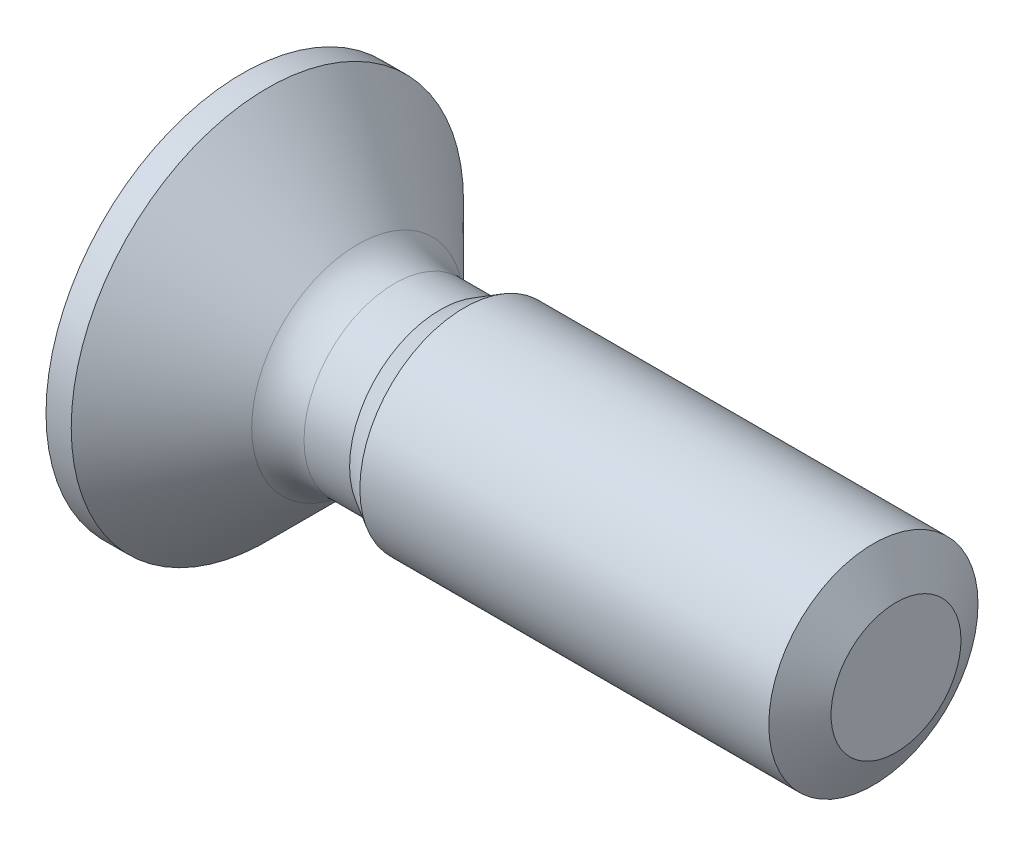
ISO-10303-21;
HEADER;
FILE_DESCRIPTION(('STEP AP214'),'2;1');
FILE_NAME('part.step','',(''),(''),'','','');
FILE_SCHEMA(('AUTOMOTIVE_DESIGN { 1 0 10303 214 1 1 1 1 }'));
ENDSEC;
DATA;
#1=APPLICATION_CONTEXT('core data for automotive mechanical design processes');
#2=APPLICATION_PROTOCOL_DEFINITION('international standard','automotive_design',2000,#1);
#3=PRODUCT_CONTEXT('',#1,'mechanical');
#4=PRODUCT('Part','Part','',(#3));
#5=PRODUCT_RELATED_PRODUCT_CATEGORY('part','',(#4));
#6=PRODUCT_DEFINITION_FORMATION('','',#4);
#7=PRODUCT_DEFINITION_CONTEXT('part definition',#1,'design');
#8=PRODUCT_DEFINITION('design','',#6,#7);
#9=PRODUCT_DEFINITION_SHAPE('','',#8);
#10=(LENGTH_UNIT() NAMED_UNIT(*) SI_UNIT(.MILLI.,.METRE.));
#11=(NAMED_UNIT(*) PLANE_ANGLE_UNIT() SI_UNIT($,.RADIAN.));
#12=(NAMED_UNIT(*) SI_UNIT($,.STERADIAN.) SOLID_ANGLE_UNIT());
#13=UNCERTAINTY_MEASURE_WITH_UNIT(LENGTH_MEASURE(1.E-05),#10,'distance_accuracy_value','');
#14=(GEOMETRIC_REPRESENTATION_CONTEXT(3) GLOBAL_UNCERTAINTY_ASSIGNED_CONTEXT((#13)) GLOBAL_UNIT_ASSIGNED_CONTEXT((#10,
#11,#12)) REPRESENTATION_CONTEXT('',''));
#15=CARTESIAN_POINT('',(0.,0.,0.));
#16=DIRECTION('',(0.,0.,1.));
#17=DIRECTION('',(1.,0.,0.));
#18=AXIS2_PLACEMENT_3D('',#15,#16,#17);
#19=CARTESIAN_POINT('',(0.,0.,0.));
#20=DIRECTION('',(1.,0.,0.));
#21=DIRECTION('',(0.,0.,-1.));
#22=AXIS2_PLACEMENT_3D('',#19,#20,#21);
#23=PLANE('',#22);
#24=CARTESIAN_POINT('',(0.,0.,0.));
#25=DIRECTION('',(-1.,0.,0.));
#26=DIRECTION('',(0.,0.,1.));
#27=AXIS2_PLACEMENT_3D('',#24,#25,#26);
#28=CIRCLE('',#27,1.5);
#29=CARTESIAN_POINT('',(0.,0.,1.5));
#30=VERTEX_POINT('',#29);
#31=EDGE_CURVE('E178',#30,#30,#28,.T.);
#32=ORIENTED_EDGE('',*,*,#31,.T.);
#33=EDGE_LOOP('',(#32));
#34=FACE_BOUND('',#33,.T.);
#35=DIRECTION('',(0.,1.,0.));
#36=VECTOR('',#35,1.);
#37=CARTESIAN_POINT('',(0.,0.799999999999999,0.175000000000003));
#38=LINE('',#37,#36);
#39=CARTESIAN_POINT('',(0.,0.175,0.175000000000001));
#40=VERTEX_POINT('',#39);
#41=CARTESIAN_POINT('',(0.,0.799999999999999,0.175000000000003));
#42=VERTEX_POINT('',#41);
#43=EDGE_CURVE('E100',#40,#42,#38,.T.);
#44=ORIENTED_EDGE('',*,*,#43,.F.);
#45=DIRECTION('',(0.,0.,-1.));
#46=VECTOR('',#45,1.);
#47=CARTESIAN_POINT('',(0.,0.175,-0.8));
#48=LINE('',#47,#46);
#49=CARTESIAN_POINT('',(0.,0.175,0.8));
#50=VERTEX_POINT('',#49);
#51=EDGE_CURVE('E145',#50,#40,#48,.T.);
#52=ORIENTED_EDGE('',*,*,#51,.F.);
#53=DIRECTION('',(0.,1.,0.));
#54=VECTOR('',#53,1.);
#55=CARTESIAN_POINT('',(0.,0.175,0.8));
#56=LINE('',#55,#54);
#57=CARTESIAN_POINT('',(0.,-0.175,0.8));
#58=VERTEX_POINT('',#57);
#59=EDGE_CURVE('E142',#58,#50,#56,.T.);
#60=ORIENTED_EDGE('',*,*,#59,.F.);
#61=DIRECTION('',(0.,0.,1.));
#62=VECTOR('',#61,1.);
#63=CARTESIAN_POINT('',(0.,-0.175,-0.8));
#64=LINE('',#63,#62);
#65=CARTESIAN_POINT('',(0.,-0.175,0.174999999999999));
#66=VERTEX_POINT('',#65);
#67=EDGE_CURVE('E73',#66,#58,#64,.T.);
#68=ORIENTED_EDGE('',*,*,#67,.F.);
#69=CARTESIAN_POINT('',(0.,-0.800000000000001,0.174999999999997));
#70=VERTEX_POINT('',#69);
#71=EDGE_CURVE('E108',#70,#66,#38,.T.);
#72=ORIENTED_EDGE('',*,*,#71,.F.);
#73=DIRECTION('',(0.,0.,1.));
#74=VECTOR('',#73,1.);
#75=CARTESIAN_POINT('',(0.,-0.800000000000001,0.174999999999997));
#76=LINE('',#75,#74);
#77=CARTESIAN_POINT('',(0.,-0.799999999999999,-0.175000000000003));
#78=VERTEX_POINT('',#77);
#79=EDGE_CURVE('E109',#78,#70,#76,.T.);
#80=ORIENTED_EDGE('',*,*,#79,.F.);
#81=DIRECTION('',(0.,-1.,0.));
#82=VECTOR('',#81,1.);
#83=CARTESIAN_POINT('',(0.,0.800000000000001,-0.174999999999997));
#84=LINE('',#83,#82);
#85=CARTESIAN_POINT('',(0.,-0.175,-0.175000000000001));
#86=VERTEX_POINT('',#85);
#87=EDGE_CURVE('E122',#86,#78,#84,.T.);
#88=ORIENTED_EDGE('',*,*,#87,.F.);
#89=CARTESIAN_POINT('',(0.,-0.175,-0.8));
#90=VERTEX_POINT('',#89);
#91=EDGE_CURVE('E139',#90,#86,#64,.T.);
#92=ORIENTED_EDGE('',*,*,#91,.F.);
#93=DIRECTION('',(0.,-1.,0.));
#94=VECTOR('',#93,1.);
#95=CARTESIAN_POINT('',(0.,0.175,-0.8));
#96=LINE('',#95,#94);
#97=CARTESIAN_POINT('',(0.,0.175,-0.8));
#98=VERTEX_POINT('',#97);
#99=EDGE_CURVE('E50',#98,#90,#96,.T.);
#100=ORIENTED_EDGE('',*,*,#99,.F.);
#101=CARTESIAN_POINT('',(0.,0.175,-0.174999999999999));
#102=VERTEX_POINT('',#101);
#103=EDGE_CURVE('E148',#102,#98,#48,.T.);
#104=ORIENTED_EDGE('',*,*,#103,.F.);
#105=CARTESIAN_POINT('',(0.,0.800000000000001,-0.174999999999997));
#106=VERTEX_POINT('',#105);
#107=EDGE_CURVE('E121',#106,#102,#84,.T.);
#108=ORIENTED_EDGE('',*,*,#107,.F.);
#109=DIRECTION('',(0.,0.,-1.));
#110=VECTOR('',#109,1.);
#111=CARTESIAN_POINT('',(0.,0.799999999999999,0.175000000000003));
#112=LINE('',#111,#110);
#113=EDGE_CURVE('E114',#42,#106,#112,.T.);
#114=ORIENTED_EDGE('',*,*,#113,.F.);
#115=EDGE_LOOP('',(#44,#52,#60,#68,#72,#80,#88,#92,#100,#104,#108,#114));
#116=FACE_BOUND('',#115,.T.);
#117=ADVANCED_FACE('F36',(#34,#116),#23,.F.);
#118=CARTESIAN_POINT('',(0.9,0.,0.));
#119=DIRECTION('',(-0.190869659102224,-0.981615389668581,0.));
#120=DIRECTION('',(0.981615389668581,-0.190869659102224,0.));
#121=AXIS2_PLACEMENT_3D('',#118,#119,#120);
#122=PLANE('',#121);
#123=ORIENTED_EDGE('',*,*,#51,.T.);
#124=DIRECTION('',(0.964208851210044,-0.187485054401953,-0.187485054401954));
#125=VECTOR('',#124,1.);
#126=CARTESIAN_POINT('',(0.9,0.,0.));
#127=LINE('',#126,#125);
#128=CARTESIAN_POINT('',(0.9,0.,0.));
#129=VERTEX_POINT('',#128);
#130=EDGE_CURVE('E79',#40,#129,#127,.T.);
#131=ORIENTED_EDGE('',*,*,#130,.T.);
#132=DIRECTION('',(0.739639285522949,-0.143818749962796,-0.657457142687066));
#133=VECTOR('',#132,1.);
#134=CARTESIAN_POINT('',(0.,0.175,0.8));
#135=LINE('',#134,#133);
#136=EDGE_CURVE('E59',#50,#129,#135,.T.);
#137=ORIENTED_EDGE('',*,*,#136,.F.);
#138=EDGE_LOOP('',(#123,#131,#137));
#139=FACE_BOUND('',#138,.T.);
#140=ADVANCED_FACE('F194',(#139),#122,.T.);
#141=DIRECTION('',(0.739639285522949,-0.143818749962796,0.657457142687066));
#142=VECTOR('',#141,1.);
#143=CARTESIAN_POINT('',(0.,0.175,-0.8));
#144=LINE('',#143,#142);
#145=EDGE_CURVE('E144',#98,#129,#144,.T.);
#146=ORIENTED_EDGE('',*,*,#145,.T.);
#147=DIRECTION('',(-0.964208851210045,0.187485054401953,-0.187485054401952));
#148=VECTOR('',#147,1.);
#149=CARTESIAN_POINT('',(0.9,0.,0.));
#150=LINE('',#149,#148);
#151=EDGE_CURVE('E126',#129,#102,#150,.T.);
#152=ORIENTED_EDGE('',*,*,#151,.T.);
#153=ORIENTED_EDGE('',*,*,#103,.T.);
#154=EDGE_LOOP('',(#146,#152,#153));
#155=FACE_BOUND('',#154,.T.);
#156=ADVANCED_FACE('F188',(#155),#122,.T.);
#157=CARTESIAN_POINT('',(0.9,0.,0.));
#158=DIRECTION('',(-0.190869659102224,0.981615389668581,0.));
#159=DIRECTION('',(-0.981615389668581,-0.190869659102224,0.));
#160=AXIS2_PLACEMENT_3D('',#157,#158,#159);
#161=PLANE('',#160);
#162=DIRECTION('',(0.739639285522949,0.143818749962796,-0.657457142687066));
#163=VECTOR('',#162,1.);
#164=CARTESIAN_POINT('',(0.,-0.175,0.8));
#165=LINE('',#164,#163);
#166=EDGE_CURVE('E138',#58,#129,#165,.T.);
#167=ORIENTED_EDGE('',*,*,#166,.T.);
#168=DIRECTION('',(-0.964208851210045,-0.187485054401953,0.187485054401952));
#169=VECTOR('',#168,1.);
#170=CARTESIAN_POINT('',(0.9,0.,0.));
#171=LINE('',#170,#169);
#172=EDGE_CURVE('E11',#129,#66,#171,.T.);
#173=ORIENTED_EDGE('',*,*,#172,.T.);
#174=ORIENTED_EDGE('',*,*,#67,.T.);
#175=EDGE_LOOP('',(#167,#173,#174));
#176=FACE_BOUND('',#175,.T.);
#177=ADVANCED_FACE('F189',(#176),#161,.T.);
#178=ORIENTED_EDGE('',*,*,#91,.T.);
#179=DIRECTION('',(0.964208851210044,0.187485054401953,0.187485054401954));
#180=VECTOR('',#179,1.);
#181=CARTESIAN_POINT('',(0.9,0.,0.));
#182=LINE('',#181,#180);
#183=EDGE_CURVE('E43',#86,#129,#182,.T.);
#184=ORIENTED_EDGE('',*,*,#183,.T.);
#185=DIRECTION('',(0.739639285522949,0.143818749962796,0.657457142687066));
#186=VECTOR('',#185,1.);
#187=CARTESIAN_POINT('',(0.,-0.175,-0.8));
#188=LINE('',#187,#186);
#189=EDGE_CURVE('E153',#90,#129,#188,.T.);
#190=ORIENTED_EDGE('',*,*,#189,.F.);
#191=EDGE_LOOP('',(#178,#184,#190));
#192=FACE_BOUND('',#191,.T.);
#193=ADVANCED_FACE('F182',(#192),#161,.T.);
#194=CARTESIAN_POINT('',(0.,0.,0.));
#195=DIRECTION('',(-1.,0.,0.));
#196=DIRECTION('',(0.,0.,1.));
#197=AXIS2_PLACEMENT_3D('',#194,#195,#196);
#198=CYLINDRICAL_SURFACE('',#197,1.5);
#199=ORIENTED_EDGE('',*,*,#31,.F.);
#200=EDGE_LOOP('',(#199));
#201=FACE_BOUND('',#200,.T.);
#202=CARTESIAN_POINT('',(0.192800000000003,0.,0.));
#203=DIRECTION('',(-1.,0.,0.));
#204=DIRECTION('',(0.,0.,1.));
#205=AXIS2_PLACEMENT_3D('',#202,#203,#204);
#206=CIRCLE('',#205,1.5);
#207=CARTESIAN_POINT('',(0.192800000000003,0.,1.5));
#208=VERTEX_POINT('',#207);
#209=EDGE_CURVE('E174',#208,#208,#206,.T.);
#210=ORIENTED_EDGE('',*,*,#209,.T.);
#211=EDGE_LOOP('',(#210));
#212=FACE_BOUND('',#211,.T.);
#213=ADVANCED_FACE('F222',(#201,#212),#198,.T.);
#214=CARTESIAN_POINT('',(0.882842712474619,0.,0.));
#215=DIRECTION('',(-1.,0.,0.));
#216=DIRECTION('',(0.,0.,1.));
#217=AXIS2_PLACEMENT_3D('',#214,#215,#216);
#218=CONICAL_SURFACE('',#217,0.809957287525381,0.78539816339745);
#219=ORIENTED_EDGE('',*,*,#209,.F.);
#220=EDGE_LOOP('',(#219));
#221=FACE_BOUND('',#220,.T.);
#222=CARTESIAN_POINT('',(0.882842712474619,0.,0.));
#223=DIRECTION('',(-1.,0.,0.));
#224=DIRECTION('',(0.,0.,1.));
#225=AXIS2_PLACEMENT_3D('',#222,#223,#224);
#226=CIRCLE('',#225,0.809957287525381);
#227=CARTESIAN_POINT('',(0.882842712474619,0.,0.809957287525381));
#228=VERTEX_POINT('',#227);
#229=EDGE_CURVE('E170',#228,#228,#226,.T.);
#230=ORIENTED_EDGE('',*,*,#229,.T.);
#231=EDGE_LOOP('',(#230));
#232=FACE_BOUND('',#231,.T.);
#233=ADVANCED_FACE('F225',(#221,#232),#218,.T.);
#234=CARTESIAN_POINT('',(1.16568542494924,0.,0.));
#235=DIRECTION('',(-1.,0.,0.));
#236=DIRECTION('',(0.,0.,1.));
#237=AXIS2_PLACEMENT_3D('',#234,#235,#236);
#238=TOROIDAL_SURFACE('',#237,1.0928,0.4);
#239=ORIENTED_EDGE('',*,*,#229,.F.);
#240=EDGE_LOOP('',(#239));
#241=FACE_BOUND('',#240,.T.);
#242=CARTESIAN_POINT('',(1.16568542494924,0.,0.));
#243=DIRECTION('',(-1.,0.,0.));
#244=DIRECTION('',(0.,0.,1.));
#245=AXIS2_PLACEMENT_3D('',#242,#243,#244);
#246=CIRCLE('',#245,0.6928);
#247=CARTESIAN_POINT('',(1.16568542494924,0.,0.6928));
#248=VERTEX_POINT('',#247);
#249=EDGE_CURVE('E167',#248,#248,#246,.T.);
#250=ORIENTED_EDGE('',*,*,#249,.T.);
#251=EDGE_LOOP('',(#250));
#252=FACE_BOUND('',#251,.T.);
#253=ADVANCED_FACE('F230',(#241,#252),#238,.F.);
#254=CARTESIAN_POINT('',(0.,0.,0.));
#255=DIRECTION('',(-1.,0.,0.));
#256=DIRECTION('',(0.,0.,1.));
#257=AXIS2_PLACEMENT_3D('',#254,#255,#256);
#258=CYLINDRICAL_SURFACE('',#257,0.6928);
#259=ORIENTED_EDGE('',*,*,#249,.F.);
#260=EDGE_LOOP('',(#259));
#261=FACE_BOUND('',#260,.T.);
#262=CARTESIAN_POINT('',(1.51432415342862,0.,0.));
#263=DIRECTION('',(-1.,0.,0.));
#264=DIRECTION('',(0.,0.,1.));
#265=AXIS2_PLACEMENT_3D('',#262,#263,#264);
#266=CIRCLE('',#265,0.6928);
#267=CARTESIAN_POINT('',(1.51432415342862,0.,0.6928));
#268=VERTEX_POINT('',#267);
#269=EDGE_CURVE('E164',#268,#268,#266,.T.);
#270=ORIENTED_EDGE('',*,*,#269,.T.);
#271=EDGE_LOOP('',(#270));
#272=FACE_BOUND('',#271,.T.);
#273=ADVANCED_FACE('F236',(#261,#272),#258,.T.);
#274=CARTESIAN_POINT('',(1.7,0.,0.));
#275=DIRECTION('',(1.,0.,0.));
#276=DIRECTION('',(0.,0.,-1.));
#277=AXIS2_PLACEMENT_3D('',#274,#275,#276);
#278=CONICAL_SURFACE('',#277,0.8,0.5235987755983);
#279=ORIENTED_EDGE('',*,*,#269,.F.);
#280=EDGE_LOOP('',(#279));
#281=FACE_BOUND('',#280,.T.);
#282=CARTESIAN_POINT('',(1.7,0.,0.));
#283=DIRECTION('',(-1.,0.,0.));
#284=DIRECTION('',(0.,0.,1.));
#285=AXIS2_PLACEMENT_3D('',#282,#283,#284);
#286=CIRCLE('',#285,0.8);
#287=CARTESIAN_POINT('',(1.7,0.,0.8));
#288=VERTEX_POINT('',#287);
#289=EDGE_CURVE('E161',#288,#288,#286,.T.);
#290=ORIENTED_EDGE('',*,*,#289,.T.);
#291=EDGE_LOOP('',(#290));
#292=FACE_BOUND('',#291,.T.);
#293=ADVANCED_FACE('F242',(#281,#292),#278,.T.);
#294=CARTESIAN_POINT('',(0.,0.,0.));
#295=DIRECTION('',(-1.,0.,0.));
#296=DIRECTION('',(0.,0.,1.));
#297=AXIS2_PLACEMENT_3D('',#294,#295,#296);
#298=CYLINDRICAL_SURFACE('',#297,0.8);
#299=CARTESIAN_POINT('',(4.8268956020098,0.,0.));
#300=DIRECTION('',(1.,0.,0.));
#301=DIRECTION('',(0.,0.,-1.));
#302=AXIS2_PLACEMENT_3D('',#299,#300,#301);
#303=CIRCLE('',#302,0.799999999999999);
#304=CARTESIAN_POINT('',(4.8268956020098,0.,-0.799999999999999));
#305=VERTEX_POINT('',#304);
#306=EDGE_CURVE('E158',#305,#305,#303,.T.);
#307=ORIENTED_EDGE('',*,*,#306,.F.);
#308=EDGE_LOOP('',(#307));
#309=FACE_BOUND('',#308,.T.);
#310=ORIENTED_EDGE('',*,*,#289,.F.);
#311=EDGE_LOOP('',(#310));
#312=FACE_BOUND('',#311,.T.);
#313=ADVANCED_FACE('F248',(#309,#312),#298,.T.);
#314=CARTESIAN_POINT('',(4.8268956020098,0.,0.));
#315=DIRECTION('',(-1.,0.,0.));
#316=DIRECTION('',(0.,0.,1.));
#317=AXIS2_PLACEMENT_3D('',#314,#315,#316);
#318=CONICAL_SURFACE('',#317,0.799999999999999,1.05188801855118);
#319=CARTESIAN_POINT('',(5.,0.,0.));
#320=DIRECTION('',(1.,0.,0.));
#321=DIRECTION('',(0.,0.,-1.));
#322=AXIS2_PLACEMENT_3D('',#319,#320,#321);
#323=CIRCLE('',#322,0.496899999999999);
#324=CARTESIAN_POINT('',(5.,0.,-0.496899999999999));
#325=VERTEX_POINT('',#324);
#326=EDGE_CURVE('E147',#325,#325,#323,.T.);
#327=ORIENTED_EDGE('',*,*,#326,.F.);
#328=EDGE_LOOP('',(#327));
#329=FACE_BOUND('',#328,.T.);
#330=ORIENTED_EDGE('',*,*,#306,.T.);
#331=EDGE_LOOP('',(#330));
#332=FACE_BOUND('',#331,.T.);
#333=ADVANCED_FACE('F253',(#329,#332),#318,.T.);
#334=CARTESIAN_POINT('',(5.,0.8,0.));
#335=DIRECTION('',(-1.,0.,0.));
#336=DIRECTION('',(0.,0.,1.));
#337=AXIS2_PLACEMENT_3D('',#334,#335,#336);
#338=PLANE('',#337);
#339=ORIENTED_EDGE('',*,*,#326,.T.);
#340=EDGE_LOOP('',(#339));
#341=FACE_BOUND('',#340,.T.);
#342=ADVANCED_FACE('F259',(#341),#338,.F.);
#343=CARTESIAN_POINT('',(0.,0.175,-0.8));
#344=DIRECTION('',(0.66436383882992,0.,-0.74740931868366));
#345=DIRECTION('',(-0.74740931868366,0.,-0.66436383882992));
#346=AXIS2_PLACEMENT_3D('',#343,#344,#345);
#347=PLANE('',#346);
#348=ORIENTED_EDGE('',*,*,#145,.F.);
#349=ORIENTED_EDGE('',*,*,#99,.T.);
#350=ORIENTED_EDGE('',*,*,#189,.T.);
#351=EDGE_LOOP('',(#348,#349,#350));
#352=FACE_BOUND('',#351,.T.);
#353=ADVANCED_FACE('F186',(#352),#347,.F.);
#354=CARTESIAN_POINT('',(0.,-0.175,0.8));
#355=DIRECTION('',(0.66436383882992,0.,0.74740931868366));
#356=DIRECTION('',(0.74740931868366,0.,-0.66436383882992));
#357=AXIS2_PLACEMENT_3D('',#354,#355,#356);
#358=PLANE('',#357);
#359=ORIENTED_EDGE('',*,*,#166,.F.);
#360=ORIENTED_EDGE('',*,*,#59,.T.);
#361=ORIENTED_EDGE('',*,*,#136,.T.);
#362=EDGE_LOOP('',(#359,#360,#361));
#363=FACE_BOUND('',#362,.T.);
#364=ADVANCED_FACE('F193',(#363),#358,.F.);
#365=CARTESIAN_POINT('',(0.9,0.,0.));
#366=DIRECTION('',(-0.190869659102224,0.,-0.981615389668581));
#367=DIRECTION('',(0.981615389668581,0.,-0.190869659102224));
#368=AXIS2_PLACEMENT_3D('',#365,#366,#367);
#369=PLANE('',#368);
#370=DIRECTION('',(0.739639285522949,0.657457142687066,-0.143818749962793));
#371=VECTOR('',#370,1.);
#372=CARTESIAN_POINT('',(0.,-0.800000000000001,0.174999999999997));
#373=LINE('',#372,#371);
#374=EDGE_CURVE('E118',#70,#129,#373,.T.);
#375=ORIENTED_EDGE('',*,*,#374,.F.);
#376=ORIENTED_EDGE('',*,*,#71,.T.);
#377=ORIENTED_EDGE('',*,*,#172,.F.);
#378=EDGE_LOOP('',(#375,#376,#377));
#379=FACE_BOUND('',#378,.T.);
#380=ADVANCED_FACE('F198',(#379),#369,.T.);
#381=CARTESIAN_POINT('',(0.9,0.,0.));
#382=DIRECTION('',(-0.190869659102224,0.,0.981615389668581));
#383=DIRECTION('',(-0.981615389668581,0.,-0.190869659102224));
#384=AXIS2_PLACEMENT_3D('',#381,#382,#383);
#385=PLANE('',#384);
#386=ORIENTED_EDGE('',*,*,#87,.T.);
#387=DIRECTION('',(0.739639285522949,0.657457142687065,0.143818749962798));
#388=VECTOR('',#387,1.);
#389=CARTESIAN_POINT('',(0.,-0.799999999999999,-0.175000000000003));
#390=LINE('',#389,#388);
#391=EDGE_CURVE('E132',#78,#129,#390,.T.);
#392=ORIENTED_EDGE('',*,*,#391,.T.);
#393=ORIENTED_EDGE('',*,*,#183,.F.);
#394=EDGE_LOOP('',(#386,#392,#393));
#395=FACE_BOUND('',#394,.T.);
#396=ADVANCED_FACE('F202',(#395),#385,.T.);
#397=CARTESIAN_POINT('',(0.,-0.799999999999999,-0.175000000000003));
#398=DIRECTION('',(0.66436383882992,-0.74740931868366,0.));
#399=DIRECTION('',(0.74740931868366,0.66436383882992,0.));
#400=AXIS2_PLACEMENT_3D('',#397,#398,#399);
#401=PLANE('',#400);
#402=ORIENTED_EDGE('',*,*,#391,.F.);
#403=ORIENTED_EDGE('',*,*,#79,.T.);
#404=ORIENTED_EDGE('',*,*,#374,.T.);
#405=EDGE_LOOP('',(#402,#403,#404));
#406=FACE_BOUND('',#405,.T.);
#407=ADVANCED_FACE('F201',(#406),#401,.F.);
#408=ORIENTED_EDGE('',*,*,#43,.T.);
#409=DIRECTION('',(0.739639285522949,-0.657457142687065,-0.143818749962798));
#410=VECTOR('',#409,1.);
#411=CARTESIAN_POINT('',(0.,0.799999999999999,0.175000000000003));
#412=LINE('',#411,#410);
#413=EDGE_CURVE('E103',#42,#129,#412,.T.);
#414=ORIENTED_EDGE('',*,*,#413,.T.);
#415=ORIENTED_EDGE('',*,*,#130,.F.);
#416=EDGE_LOOP('',(#408,#414,#415));
#417=FACE_BOUND('',#416,.T.);
#418=ADVANCED_FACE('F102',(#417),#369,.T.);
#419=DIRECTION('',(0.739639285522949,-0.657457142687066,0.143818749962793));
#420=VECTOR('',#419,1.);
#421=CARTESIAN_POINT('',(0.,0.800000000000001,-0.174999999999997));
#422=LINE('',#421,#420);
#423=EDGE_CURVE('E116',#106,#129,#422,.T.);
#424=ORIENTED_EDGE('',*,*,#423,.F.);
#425=ORIENTED_EDGE('',*,*,#107,.T.);
#426=ORIENTED_EDGE('',*,*,#151,.F.);
#427=EDGE_LOOP('',(#424,#425,#426));
#428=FACE_BOUND('',#427,.T.);
#429=ADVANCED_FACE('F205',(#428),#385,.T.);
#430=CARTESIAN_POINT('',(0.,0.799999999999999,0.175000000000003));
#431=DIRECTION('',(0.66436383882992,0.74740931868366,0.));
#432=DIRECTION('',(-0.74740931868366,0.66436383882992,0.));
#433=AXIS2_PLACEMENT_3D('',#430,#431,#432);
#434=PLANE('',#433);
#435=ORIENTED_EDGE('',*,*,#413,.F.);
#436=ORIENTED_EDGE('',*,*,#113,.T.);
#437=ORIENTED_EDGE('',*,*,#423,.T.);
#438=EDGE_LOOP('',(#435,#436,#437));
#439=FACE_BOUND('',#438,.T.);
#440=ADVANCED_FACE('F113',(#439),#434,.F.);
#441=CLOSED_SHELL('',(#117,#140,#156,#177,#193,#213,#233,#253,#273,#293,#313,#333,#342,#353,
#364,#380,#396,#407,#418,#429,#440));
#442=MANIFOLD_SOLID_BREP('B2',#441);
#443=ADVANCED_BREP_SHAPE_REPRESENTATION('',(#18,#442),#14);
#444=SHAPE_DEFINITION_REPRESENTATION(#9,#443);
ENDSEC;
END-ISO-10303-21;
